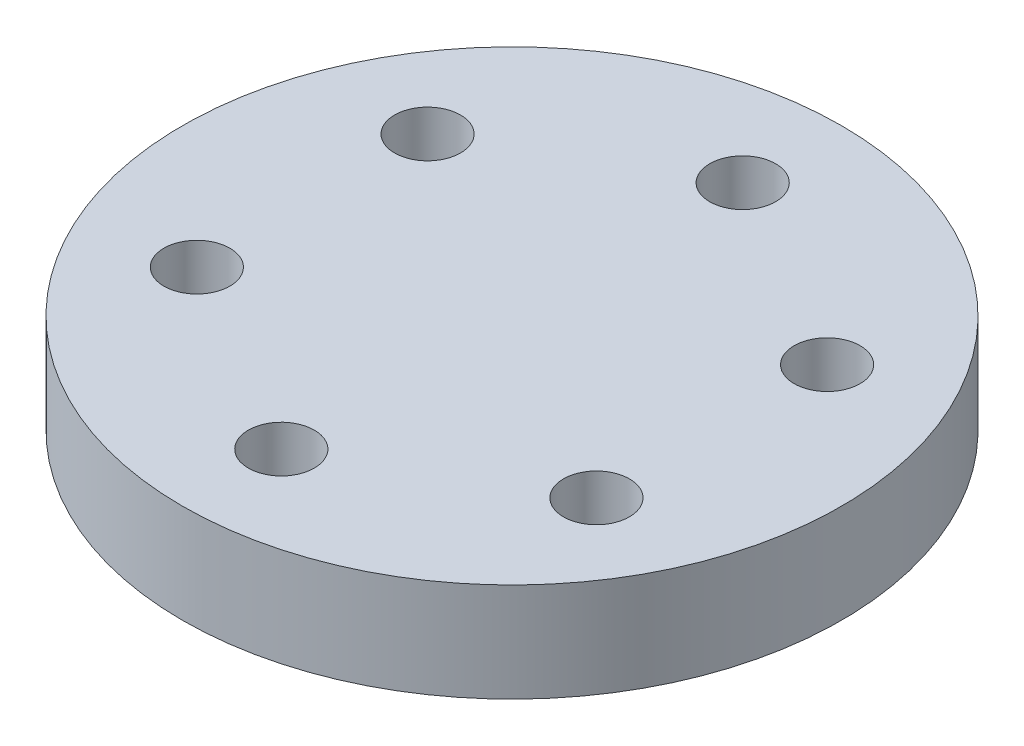
ISO-10303-21;
HEADER;
FILE_DESCRIPTION(('STEP AP214'),'2;1');
FILE_NAME('part.step','',(''),(''),'','','');
FILE_SCHEMA(('AUTOMOTIVE_DESIGN { 1 0 10303 214 1 1 1 1 }'));
ENDSEC;
DATA;
#1=APPLICATION_CONTEXT('core data for automotive mechanical design processes');
#2=APPLICATION_PROTOCOL_DEFINITION('international standard','automotive_design',2000,#1);
#3=PRODUCT_CONTEXT('',#1,'mechanical');
#4=PRODUCT('Part','Part','',(#3));
#5=PRODUCT_RELATED_PRODUCT_CATEGORY('part','',(#4));
#6=PRODUCT_DEFINITION_FORMATION('','',#4);
#7=PRODUCT_DEFINITION_CONTEXT('part definition',#1,'design');
#8=PRODUCT_DEFINITION('design','',#6,#7);
#9=PRODUCT_DEFINITION_SHAPE('','',#8);
#10=(LENGTH_UNIT() NAMED_UNIT(*) SI_UNIT(.MILLI.,.METRE.));
#11=(NAMED_UNIT(*) PLANE_ANGLE_UNIT() SI_UNIT($,.RADIAN.));
#12=(NAMED_UNIT(*) SI_UNIT($,.STERADIAN.) SOLID_ANGLE_UNIT());
#13=UNCERTAINTY_MEASURE_WITH_UNIT(LENGTH_MEASURE(1.E-05),#10,'distance_accuracy_value','');
#14=(GEOMETRIC_REPRESENTATION_CONTEXT(3) GLOBAL_UNCERTAINTY_ASSIGNED_CONTEXT((#13)) GLOBAL_UNIT_ASSIGNED_CONTEXT((#10,
#11,#12)) REPRESENTATION_CONTEXT('',''));
#15=CARTESIAN_POINT('',(0.,0.,0.));
#16=DIRECTION('',(0.,0.,1.));
#17=DIRECTION('',(1.,0.,0.));
#18=AXIS2_PLACEMENT_3D('',#15,#16,#17);
#19=CARTESIAN_POINT('',(0.,15.,0.));
#20=DIRECTION('',(0.,-1.,0.));
#21=DIRECTION('',(0.,0.,-1.));
#22=AXIS2_PLACEMENT_3D('',#19,#20,#21);
#23=CYLINDRICAL_SURFACE('',#22,50.);
#24=CARTESIAN_POINT('',(0.,15.,0.));
#25=DIRECTION('',(0.,1.,0.));
#26=DIRECTION('',(0.,0.,1.));
#27=AXIS2_PLACEMENT_3D('',#24,#25,#26);
#28=CIRCLE('',#27,50.);
#29=CARTESIAN_POINT('',(0.,15.,50.));
#30=VERTEX_POINT('',#29);
#31=EDGE_CURVE('E10',#30,#30,#28,.T.);
#32=ORIENTED_EDGE('',*,*,#31,.F.);
#33=EDGE_LOOP('',(#32));
#34=FACE_BOUND('',#33,.T.);
#35=CARTESIAN_POINT('',(0.,0.,0.));
#36=DIRECTION('',(0.,1.,0.));
#37=DIRECTION('',(0.,0.,1.));
#38=AXIS2_PLACEMENT_3D('',#35,#36,#37);
#39=CIRCLE('',#38,50.);
#40=CARTESIAN_POINT('',(0.,0.,50.));
#41=VERTEX_POINT('',#40);
#42=EDGE_CURVE('E34',#41,#41,#39,.T.);
#43=ORIENTED_EDGE('',*,*,#42,.T.);
#44=EDGE_LOOP('',(#43));
#45=FACE_BOUND('',#44,.T.);
#46=ADVANCED_FACE('F31',(#34,#45),#23,.T.);
#47=CARTESIAN_POINT('',(0.,15.,0.));
#48=DIRECTION('',(0.,1.,0.));
#49=DIRECTION('',(0.,0.,1.));
#50=AXIS2_PLACEMENT_3D('',#47,#48,#49);
#51=PLANE('',#50);
#52=CARTESIAN_POINT('',(30.3108891324552,15.,-17.5000000000004));
#53=DIRECTION('',(0.,1.,0.));
#54=DIRECTION('',(-0.866025403784433,0.,0.50000000000001));
#55=AXIS2_PLACEMENT_3D('',#52,#53,#54);
#56=CIRCLE('',#55,5.);
#57=CARTESIAN_POINT('',(25.980762113533,15.,-15.0000000000003));
#58=VERTEX_POINT('',#57);
#59=EDGE_CURVE('E55',#58,#58,#56,.T.);
#60=ORIENTED_EDGE('',*,*,#59,.F.);
#61=EDGE_LOOP('',(#60));
#62=FACE_BOUND('',#61,.T.);
#63=CARTESIAN_POINT('',(30.3108891324555,15.,17.4999999999997));
#64=DIRECTION('',(0.,1.,0.));
#65=DIRECTION('',(-0.866025403784443,0.,-0.499999999999992));
#66=AXIS2_PLACEMENT_3D('',#63,#64,#65);
#67=CIRCLE('',#66,5.);
#68=CARTESIAN_POINT('',(25.9807621135333,15.,14.9999999999998));
#69=VERTEX_POINT('',#68);
#70=EDGE_CURVE('E61',#69,#69,#67,.T.);
#71=ORIENTED_EDGE('',*,*,#70,.F.);
#72=EDGE_LOOP('',(#71));
#73=FACE_BOUND('',#72,.T.);
#74=CARTESIAN_POINT('',(0.,15.,35.));
#75=DIRECTION('',(0.,1.,0.));
#76=DIRECTION('',(0.,0.,-1.));
#77=AXIS2_PLACEMENT_3D('',#74,#75,#76);
#78=CIRCLE('',#77,5.);
#79=CARTESIAN_POINT('',(0.,15.,30.));
#80=VERTEX_POINT('',#79);
#81=EDGE_CURVE('E67',#80,#80,#78,.T.);
#82=ORIENTED_EDGE('',*,*,#81,.F.);
#83=EDGE_LOOP('',(#82));
#84=FACE_BOUND('',#83,.T.);
#85=CARTESIAN_POINT('',(-30.3108891324553,15.,17.5000000000001));
#86=DIRECTION('',(0.,1.,0.));
#87=DIRECTION('',(0.866025403784436,0.,-0.500000000000004));
#88=AXIS2_PLACEMENT_3D('',#85,#86,#87);
#89=CIRCLE('',#88,5.);
#90=CARTESIAN_POINT('',(-25.9807621135331,15.,15.0000000000001));
#91=VERTEX_POINT('',#90);
#92=EDGE_CURVE('E73',#91,#91,#89,.T.);
#93=ORIENTED_EDGE('',*,*,#92,.F.);
#94=EDGE_LOOP('',(#93));
#95=FACE_BOUND('',#94,.T.);
#96=CARTESIAN_POINT('',(-30.3108891324554,15.,-17.4999999999999));
#97=DIRECTION('',(0.,1.,0.));
#98=DIRECTION('',(0.86602540378444,0.,0.499999999999998));
#99=AXIS2_PLACEMENT_3D('',#96,#97,#98);
#100=CIRCLE('',#99,5.);
#101=CARTESIAN_POINT('',(-25.9807621135332,15.,-14.9999999999999));
#102=VERTEX_POINT('',#101);
#103=EDGE_CURVE('E49',#102,#102,#100,.T.);
#104=ORIENTED_EDGE('',*,*,#103,.F.);
#105=EDGE_LOOP('',(#104));
#106=FACE_BOUND('',#105,.T.);
#107=CARTESIAN_POINT('',(0.,15.,-35.));
#108=DIRECTION('',(0.,1.,0.));
#109=DIRECTION('',(0.,0.,1.));
#110=AXIS2_PLACEMENT_3D('',#107,#108,#109);
#111=CIRCLE('',#110,5.);
#112=CARTESIAN_POINT('',(0.,15.,-30.));
#113=VERTEX_POINT('',#112);
#114=EDGE_CURVE('E43',#113,#113,#111,.T.);
#115=ORIENTED_EDGE('',*,*,#114,.F.);
#116=EDGE_LOOP('',(#115));
#117=FACE_BOUND('',#116,.T.);
#118=ORIENTED_EDGE('',*,*,#31,.T.);
#119=EDGE_LOOP('',(#118));
#120=FACE_BOUND('',#119,.T.);
#121=ADVANCED_FACE('F90',(#62,#73,#84,#95,#106,#117,#120),#51,.T.);
#122=CARTESIAN_POINT('',(0.,0.,0.));
#123=DIRECTION('',(0.,1.,0.));
#124=DIRECTION('',(0.,0.,1.));
#125=AXIS2_PLACEMENT_3D('',#122,#123,#124);
#126=PLANE('',#125);
#127=CARTESIAN_POINT('',(30.3108891324552,0.,-17.5000000000004));
#128=DIRECTION('',(0.,1.,0.));
#129=DIRECTION('',(-0.866025403784433,0.,0.50000000000001));
#130=AXIS2_PLACEMENT_3D('',#127,#128,#129);
#131=CIRCLE('',#130,5.);
#132=CARTESIAN_POINT('',(25.980762113533,0.,-15.0000000000003));
#133=VERTEX_POINT('',#132);
#134=EDGE_CURVE('E58',#133,#133,#131,.T.);
#135=ORIENTED_EDGE('',*,*,#134,.T.);
#136=EDGE_LOOP('',(#135));
#137=FACE_BOUND('',#136,.T.);
#138=CARTESIAN_POINT('',(30.3108891324555,0.,17.4999999999997));
#139=DIRECTION('',(0.,1.,0.));
#140=DIRECTION('',(-0.866025403784443,0.,-0.499999999999992));
#141=AXIS2_PLACEMENT_3D('',#138,#139,#140);
#142=CIRCLE('',#141,5.);
#143=CARTESIAN_POINT('',(25.9807621135333,0.,14.9999999999998));
#144=VERTEX_POINT('',#143);
#145=EDGE_CURVE('E64',#144,#144,#142,.T.);
#146=ORIENTED_EDGE('',*,*,#145,.T.);
#147=EDGE_LOOP('',(#146));
#148=FACE_BOUND('',#147,.T.);
#149=CARTESIAN_POINT('',(0.,0.,35.));
#150=DIRECTION('',(0.,1.,0.));
#151=DIRECTION('',(0.,0.,-1.));
#152=AXIS2_PLACEMENT_3D('',#149,#150,#151);
#153=CIRCLE('',#152,5.);
#154=CARTESIAN_POINT('',(0.,0.,30.));
#155=VERTEX_POINT('',#154);
#156=EDGE_CURVE('E70',#155,#155,#153,.T.);
#157=ORIENTED_EDGE('',*,*,#156,.T.);
#158=EDGE_LOOP('',(#157));
#159=FACE_BOUND('',#158,.T.);
#160=CARTESIAN_POINT('',(-30.3108891324553,0.,17.5000000000001));
#161=DIRECTION('',(0.,1.,0.));
#162=DIRECTION('',(0.866025403784436,0.,-0.500000000000004));
#163=AXIS2_PLACEMENT_3D('',#160,#161,#162);
#164=CIRCLE('',#163,5.);
#165=CARTESIAN_POINT('',(-25.9807621135331,0.,15.0000000000001));
#166=VERTEX_POINT('',#165);
#167=EDGE_CURVE('E52',#166,#166,#164,.T.);
#168=ORIENTED_EDGE('',*,*,#167,.T.);
#169=EDGE_LOOP('',(#168));
#170=FACE_BOUND('',#169,.T.);
#171=CARTESIAN_POINT('',(-30.3108891324554,0.,-17.4999999999999));
#172=DIRECTION('',(0.,1.,0.));
#173=DIRECTION('',(0.86602540378444,0.,0.499999999999998));
#174=AXIS2_PLACEMENT_3D('',#171,#172,#173);
#175=CIRCLE('',#174,5.);
#176=CARTESIAN_POINT('',(-25.9807621135332,0.,-14.9999999999999));
#177=VERTEX_POINT('',#176);
#178=EDGE_CURVE('E46',#177,#177,#175,.T.);
#179=ORIENTED_EDGE('',*,*,#178,.T.);
#180=EDGE_LOOP('',(#179));
#181=FACE_BOUND('',#180,.T.);
#182=CARTESIAN_POINT('',(0.,0.,-35.));
#183=DIRECTION('',(0.,1.,0.));
#184=DIRECTION('',(0.,0.,1.));
#185=AXIS2_PLACEMENT_3D('',#182,#183,#184);
#186=CIRCLE('',#185,5.);
#187=CARTESIAN_POINT('',(0.,0.,-30.));
#188=VERTEX_POINT('',#187);
#189=EDGE_CURVE('E41',#188,#188,#186,.T.);
#190=ORIENTED_EDGE('',*,*,#189,.T.);
#191=EDGE_LOOP('',(#190));
#192=FACE_BOUND('',#191,.T.);
#193=ORIENTED_EDGE('',*,*,#42,.F.);
#194=EDGE_LOOP('',(#193));
#195=FACE_BOUND('',#194,.T.);
#196=ADVANCED_FACE('F79',(#137,#148,#159,#170,#181,#192,#195),#126,.F.);
#197=CARTESIAN_POINT('',(0.,0.,-35.));
#198=DIRECTION('',(0.,1.,0.));
#199=DIRECTION('',(0.,0.,1.));
#200=AXIS2_PLACEMENT_3D('',#197,#198,#199);
#201=CYLINDRICAL_SURFACE('',#200,5.);
#202=ORIENTED_EDGE('',*,*,#189,.F.);
#203=EDGE_LOOP('',(#202));
#204=FACE_BOUND('',#203,.T.);
#205=ORIENTED_EDGE('',*,*,#114,.T.);
#206=EDGE_LOOP('',(#205));
#207=FACE_BOUND('',#206,.T.);
#208=ADVANCED_FACE('F99',(#204,#207),#201,.F.);
#209=CARTESIAN_POINT('',(-30.3108891324554,0.,-17.4999999999999));
#210=DIRECTION('',(0.,1.,0.));
#211=DIRECTION('',(0.,0.,1.));
#212=AXIS2_PLACEMENT_3D('',#209,#210,#211);
#213=CYLINDRICAL_SURFACE('',#212,5.);
#214=ORIENTED_EDGE('',*,*,#178,.F.);
#215=EDGE_LOOP('',(#214));
#216=FACE_BOUND('',#215,.T.);
#217=ORIENTED_EDGE('',*,*,#103,.T.);
#218=EDGE_LOOP('',(#217));
#219=FACE_BOUND('',#218,.T.);
#220=ADVANCED_FACE('F86',(#216,#219),#213,.F.);
#221=CARTESIAN_POINT('',(-30.3108891324553,0.,17.5000000000001));
#222=DIRECTION('',(0.,1.,0.));
#223=DIRECTION('',(0.,0.,1.));
#224=AXIS2_PLACEMENT_3D('',#221,#222,#223);
#225=CYLINDRICAL_SURFACE('',#224,5.);
#226=ORIENTED_EDGE('',*,*,#167,.F.);
#227=EDGE_LOOP('',(#226));
#228=FACE_BOUND('',#227,.T.);
#229=ORIENTED_EDGE('',*,*,#92,.T.);
#230=EDGE_LOOP('',(#229));
#231=FACE_BOUND('',#230,.T.);
#232=ADVANCED_FACE('F82',(#228,#231),#225,.F.);
#233=CARTESIAN_POINT('',(0.,0.,35.));
#234=DIRECTION('',(0.,1.,0.));
#235=DIRECTION('',(0.,0.,1.));
#236=AXIS2_PLACEMENT_3D('',#233,#234,#235);
#237=CYLINDRICAL_SURFACE('',#236,5.);
#238=ORIENTED_EDGE('',*,*,#156,.F.);
#239=EDGE_LOOP('',(#238));
#240=FACE_BOUND('',#239,.T.);
#241=ORIENTED_EDGE('',*,*,#81,.T.);
#242=EDGE_LOOP('',(#241));
#243=FACE_BOUND('',#242,.T.);
#244=ADVANCED_FACE('F85',(#240,#243),#237,.F.);
#245=CARTESIAN_POINT('',(30.3108891324555,0.,17.4999999999997));
#246=DIRECTION('',(0.,1.,0.));
#247=DIRECTION('',(0.,0.,1.));
#248=AXIS2_PLACEMENT_3D('',#245,#246,#247);
#249=CYLINDRICAL_SURFACE('',#248,5.);
#250=ORIENTED_EDGE('',*,*,#145,.F.);
#251=EDGE_LOOP('',(#250));
#252=FACE_BOUND('',#251,.T.);
#253=ORIENTED_EDGE('',*,*,#70,.T.);
#254=EDGE_LOOP('',(#253));
#255=FACE_BOUND('',#254,.T.);
#256=ADVANCED_FACE('F148',(#252,#255),#249,.F.);
#257=CARTESIAN_POINT('',(30.3108891324552,0.,-17.5000000000004));
#258=DIRECTION('',(0.,1.,0.));
#259=DIRECTION('',(0.,0.,1.));
#260=AXIS2_PLACEMENT_3D('',#257,#258,#259);
#261=CYLINDRICAL_SURFACE('',#260,5.);
#262=ORIENTED_EDGE('',*,*,#134,.F.);
#263=EDGE_LOOP('',(#262));
#264=FACE_BOUND('',#263,.T.);
#265=ORIENTED_EDGE('',*,*,#59,.T.);
#266=EDGE_LOOP('',(#265));
#267=FACE_BOUND('',#266,.T.);
#268=ADVANCED_FACE('F158',(#264,#267),#261,.F.);
#269=CLOSED_SHELL('',(#46,#121,#196,#208,#220,#232,#244,#256,#268));
#270=MANIFOLD_SOLID_BREP('B2',#269);
#271=ADVANCED_BREP_SHAPE_REPRESENTATION('',(#18,#270),#14);
#272=SHAPE_DEFINITION_REPRESENTATION(#9,#271);
ENDSEC;
END-ISO-10303-21;
